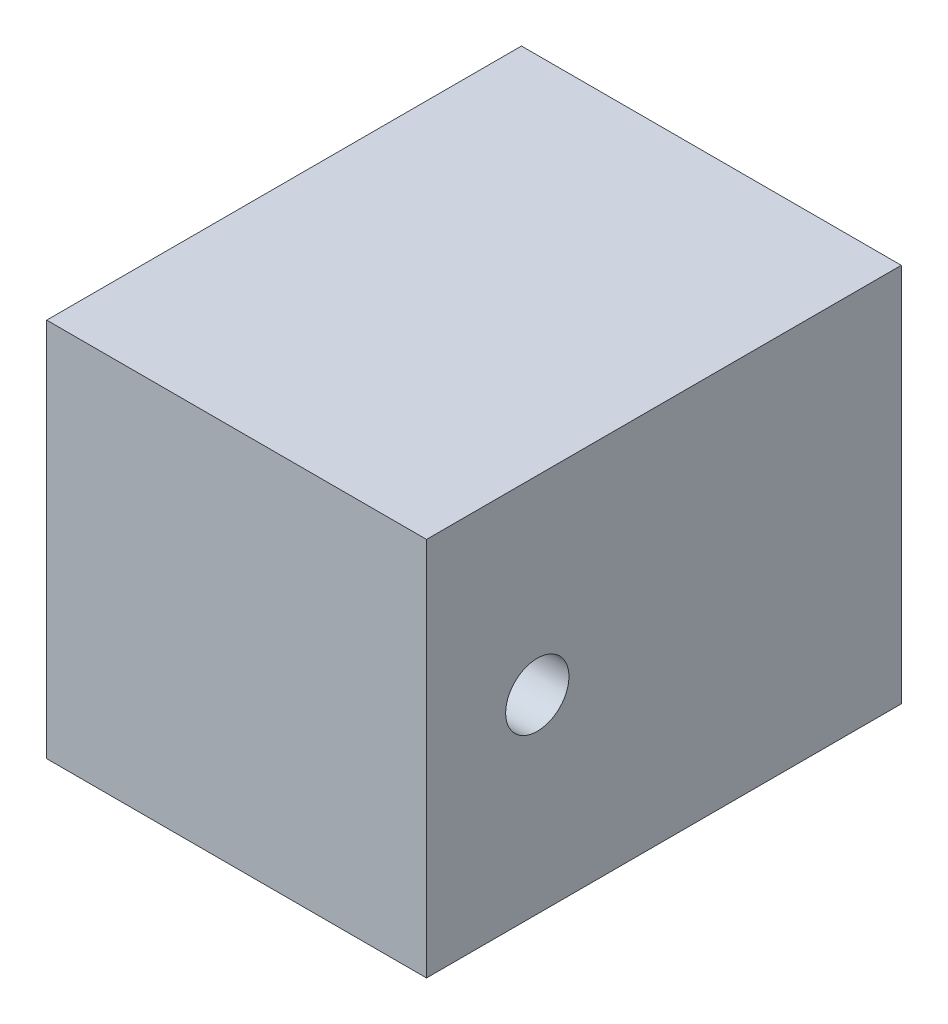
ISO-10303-21;
HEADER;
FILE_DESCRIPTION(('STEP AP214'),'2;1');
FILE_NAME('part.step','',(''),(''),'','','');
FILE_SCHEMA(('AUTOMOTIVE_DESIGN { 1 0 10303 214 1 1 1 1 }'));
ENDSEC;
DATA;
#1=APPLICATION_CONTEXT('core data for automotive mechanical design processes');
#2=APPLICATION_PROTOCOL_DEFINITION('international standard','automotive_design',2000,#1);
#3=PRODUCT_CONTEXT('',#1,'mechanical');
#4=PRODUCT('Part','Part','',(#3));
#5=PRODUCT_RELATED_PRODUCT_CATEGORY('part','',(#4));
#6=PRODUCT_DEFINITION_FORMATION('','',#4);
#7=PRODUCT_DEFINITION_CONTEXT('part definition',#1,'design');
#8=PRODUCT_DEFINITION('design','',#6,#7);
#9=PRODUCT_DEFINITION_SHAPE('','',#8);
#10=(LENGTH_UNIT() NAMED_UNIT(*) SI_UNIT(.MILLI.,.METRE.));
#11=(NAMED_UNIT(*) PLANE_ANGLE_UNIT() SI_UNIT($,.RADIAN.));
#12=(NAMED_UNIT(*) SI_UNIT($,.STERADIAN.) SOLID_ANGLE_UNIT());
#13=UNCERTAINTY_MEASURE_WITH_UNIT(LENGTH_MEASURE(1.E-05),#10,'distance_accuracy_value','');
#14=(GEOMETRIC_REPRESENTATION_CONTEXT(3) GLOBAL_UNCERTAINTY_ASSIGNED_CONTEXT((#13)) GLOBAL_UNIT_ASSIGNED_CONTEXT((#10,
#11,#12)) REPRESENTATION_CONTEXT('',''));
#15=CARTESIAN_POINT('',(0.,0.,0.));
#16=DIRECTION('',(0.,0.,1.));
#17=DIRECTION('',(1.,0.,0.));
#18=AXIS2_PLACEMENT_3D('',#15,#16,#17);
#19=CARTESIAN_POINT('',(0.,0.,0.));
#20=DIRECTION('',(0.,0.,-1.));
#21=DIRECTION('',(-1.,0.,0.));
#22=AXIS2_PLACEMENT_3D('',#19,#20,#21);
#23=PLANE('',#22);
#24=DIRECTION('',(0.,-1.,0.));
#25=VECTOR('',#24,1.);
#26=CARTESIAN_POINT('',(0.,0.,0.));
#27=LINE('',#26,#25);
#28=CARTESIAN_POINT('',(0.,12.,0.));
#29=VERTEX_POINT('',#28);
#30=CARTESIAN_POINT('',(0.,0.,0.));
#31=VERTEX_POINT('',#30);
#32=EDGE_CURVE('E112',#29,#31,#27,.T.);
#33=ORIENTED_EDGE('',*,*,#32,.F.);
#34=DIRECTION('',(-1.,0.,0.));
#35=VECTOR('',#34,1.);
#36=CARTESIAN_POINT('',(0.,12.,0.));
#37=LINE('',#36,#35);
#38=CARTESIAN_POINT('',(12.,12.,0.));
#39=VERTEX_POINT('',#38);
#40=EDGE_CURVE('E63',#39,#29,#37,.T.);
#41=ORIENTED_EDGE('',*,*,#40,.F.);
#42=DIRECTION('',(0.,1.,0.));
#43=VECTOR('',#42,1.);
#44=CARTESIAN_POINT('',(12.,0.,0.));
#45=LINE('',#44,#43);
#46=CARTESIAN_POINT('',(12.,0.,0.));
#47=VERTEX_POINT('',#46);
#48=EDGE_CURVE('E188',#47,#39,#45,.T.);
#49=ORIENTED_EDGE('',*,*,#48,.F.);
#50=DIRECTION('',(1.,0.,0.));
#51=VECTOR('',#50,1.);
#52=CARTESIAN_POINT('',(0.,0.,0.));
#53=LINE('',#52,#51);
#54=EDGE_CURVE('E185',#31,#47,#53,.T.);
#55=ORIENTED_EDGE('',*,*,#54,.F.);
#56=EDGE_LOOP('',(#33,#41,#49,#55));
#57=FACE_BOUND('',#56,.T.);
#58=DIRECTION('',(-1.,0.,0.));
#59=VECTOR('',#58,1.);
#60=CARTESIAN_POINT('',(1.,11.,0.));
#61=LINE('',#60,#59);
#62=CARTESIAN_POINT('',(11.,11.,0.));
#63=VERTEX_POINT('',#62);
#64=CARTESIAN_POINT('',(1.,11.,0.));
#65=VERTEX_POINT('',#64);
#66=EDGE_CURVE('E146',#63,#65,#61,.T.);
#67=ORIENTED_EDGE('',*,*,#66,.T.);
#68=DIRECTION('',(0.,-1.,0.));
#69=VECTOR('',#68,1.);
#70=CARTESIAN_POINT('',(1.,1.,0.));
#71=LINE('',#70,#69);
#72=CARTESIAN_POINT('',(1.,1.,0.));
#73=VERTEX_POINT('',#72);
#74=EDGE_CURVE('E55',#65,#73,#71,.T.);
#75=ORIENTED_EDGE('',*,*,#74,.T.);
#76=DIRECTION('',(1.,0.,0.));
#77=VECTOR('',#76,1.);
#78=CARTESIAN_POINT('',(1.,1.,0.));
#79=LINE('',#78,#77);
#80=CARTESIAN_POINT('',(11.,1.,0.));
#81=VERTEX_POINT('',#80);
#82=EDGE_CURVE('E161',#73,#81,#79,.T.);
#83=ORIENTED_EDGE('',*,*,#82,.T.);
#84=DIRECTION('',(0.,1.,0.));
#85=VECTOR('',#84,1.);
#86=CARTESIAN_POINT('',(11.,1.,0.));
#87=LINE('',#86,#85);
#88=EDGE_CURVE('E165',#81,#63,#87,.T.);
#89=ORIENTED_EDGE('',*,*,#88,.T.);
#90=EDGE_LOOP('',(#67,#75,#83,#89));
#91=FACE_BOUND('',#90,.T.);
#92=ADVANCED_FACE('F39',(#57,#91),#23,.T.);
#93=CARTESIAN_POINT('',(0.,0.,10.));
#94=DIRECTION('',(1.,0.,0.));
#95=DIRECTION('',(0.,0.,-1.));
#96=AXIS2_PLACEMENT_3D('',#93,#94,#95);
#97=PLANE('',#96);
#98=CARTESIAN_POINT('',(0.,6.,11.5));
#99=DIRECTION('',(-1.,0.,0.));
#100=DIRECTION('',(0.,0.,1.));
#101=AXIS2_PLACEMENT_3D('',#98,#99,#100);
#102=CIRCLE('',#101,1.);
#103=CARTESIAN_POINT('',(0.,6.,12.5));
#104=VERTEX_POINT('',#103);
#105=EDGE_CURVE('E133',#104,#104,#102,.T.);
#106=ORIENTED_EDGE('',*,*,#105,.F.);
#107=EDGE_LOOP('',(#106));
#108=FACE_BOUND('',#107,.T.);
#109=ORIENTED_EDGE('',*,*,#32,.T.);
#110=DIRECTION('',(0.,0.,-1.));
#111=VECTOR('',#110,1.);
#112=CARTESIAN_POINT('',(0.,0.,10.));
#113=LINE('',#112,#111);
#114=CARTESIAN_POINT('',(0.,0.,15.));
#115=VERTEX_POINT('',#114);
#116=EDGE_CURVE('E11',#115,#31,#113,.T.);
#117=ORIENTED_EDGE('',*,*,#116,.F.);
#118=DIRECTION('',(0.,-1.,0.));
#119=VECTOR('',#118,1.);
#120=CARTESIAN_POINT('',(0.,12.,15.));
#121=LINE('',#120,#119);
#122=CARTESIAN_POINT('',(0.,12.,15.));
#123=VERTEX_POINT('',#122);
#124=EDGE_CURVE('E110',#123,#115,#121,.T.);
#125=ORIENTED_EDGE('',*,*,#124,.F.);
#126=DIRECTION('',(0.,0.,-1.));
#127=VECTOR('',#126,1.);
#128=CARTESIAN_POINT('',(0.,12.,10.));
#129=LINE('',#128,#127);
#130=EDGE_CURVE('E193',#123,#29,#129,.T.);
#131=ORIENTED_EDGE('',*,*,#130,.T.);
#132=EDGE_LOOP('',(#109,#117,#125,#131));
#133=FACE_BOUND('',#132,.T.);
#134=ADVANCED_FACE('F41',(#108,#133),#97,.F.);
#135=CARTESIAN_POINT('',(0.,0.,10.));
#136=DIRECTION('',(0.,1.,0.));
#137=DIRECTION('',(0.,0.,1.));
#138=AXIS2_PLACEMENT_3D('',#135,#136,#137);
#139=PLANE('',#138);
#140=ORIENTED_EDGE('',*,*,#54,.T.);
#141=DIRECTION('',(0.,0.,-1.));
#142=VECTOR('',#141,1.);
#143=CARTESIAN_POINT('',(12.,0.,10.));
#144=LINE('',#143,#142);
#145=CARTESIAN_POINT('',(12.,0.,15.));
#146=VERTEX_POINT('',#145);
#147=EDGE_CURVE('E48',#146,#47,#144,.T.);
#148=ORIENTED_EDGE('',*,*,#147,.F.);
#149=DIRECTION('',(1.,0.,0.));
#150=VECTOR('',#149,1.);
#151=CARTESIAN_POINT('',(0.,0.,15.));
#152=LINE('',#151,#150);
#153=EDGE_CURVE('E115',#115,#146,#152,.T.);
#154=ORIENTED_EDGE('',*,*,#153,.F.);
#155=ORIENTED_EDGE('',*,*,#116,.T.);
#156=EDGE_LOOP('',(#140,#148,#154,#155));
#157=FACE_BOUND('',#156,.T.);
#158=ADVANCED_FACE('F116',(#157),#139,.F.);
#159=CARTESIAN_POINT('',(12.,0.,10.));
#160=DIRECTION('',(-1.,0.,0.));
#161=DIRECTION('',(0.,0.,1.));
#162=AXIS2_PLACEMENT_3D('',#159,#160,#161);
#163=PLANE('',#162);
#164=CARTESIAN_POINT('',(12.,6.,11.5));
#165=DIRECTION('',(-1.,0.,0.));
#166=DIRECTION('',(0.,0.,1.));
#167=AXIS2_PLACEMENT_3D('',#164,#165,#166);
#168=CIRCLE('',#167,1.);
#169=CARTESIAN_POINT('',(12.,6.,12.5));
#170=VERTEX_POINT('',#169);
#171=EDGE_CURVE('E129',#170,#170,#168,.T.);
#172=ORIENTED_EDGE('',*,*,#171,.T.);
#173=EDGE_LOOP('',(#172));
#174=FACE_BOUND('',#173,.T.);
#175=ORIENTED_EDGE('',*,*,#48,.T.);
#176=DIRECTION('',(0.,0.,-1.));
#177=VECTOR('',#176,1.);
#178=CARTESIAN_POINT('',(12.,12.,10.));
#179=LINE('',#178,#177);
#180=CARTESIAN_POINT('',(12.,12.,15.));
#181=VERTEX_POINT('',#180);
#182=EDGE_CURVE('E196',#181,#39,#179,.T.);
#183=ORIENTED_EDGE('',*,*,#182,.F.);
#184=DIRECTION('',(0.,1.,0.));
#185=VECTOR('',#184,1.);
#186=CARTESIAN_POINT('',(12.,12.,15.));
#187=LINE('',#186,#185);
#188=EDGE_CURVE('E122',#146,#181,#187,.T.);
#189=ORIENTED_EDGE('',*,*,#188,.F.);
#190=ORIENTED_EDGE('',*,*,#147,.T.);
#191=EDGE_LOOP('',(#175,#183,#189,#190));
#192=FACE_BOUND('',#191,.T.);
#193=ADVANCED_FACE('F201',(#174,#192),#163,.F.);
#194=CARTESIAN_POINT('',(0.,12.,10.));
#195=DIRECTION('',(0.,-1.,0.));
#196=DIRECTION('',(0.,0.,-1.));
#197=AXIS2_PLACEMENT_3D('',#194,#195,#196);
#198=PLANE('',#197);
#199=ORIENTED_EDGE('',*,*,#40,.T.);
#200=ORIENTED_EDGE('',*,*,#130,.F.);
#201=DIRECTION('',(-1.,0.,0.));
#202=VECTOR('',#201,1.);
#203=CARTESIAN_POINT('',(0.,12.,15.));
#204=LINE('',#203,#202);
#205=EDGE_CURVE('E127',#181,#123,#204,.T.);
#206=ORIENTED_EDGE('',*,*,#205,.F.);
#207=ORIENTED_EDGE('',*,*,#182,.T.);
#208=EDGE_LOOP('',(#199,#200,#206,#207));
#209=FACE_BOUND('',#208,.T.);
#210=ADVANCED_FACE('F236',(#209),#198,.F.);
#211=CARTESIAN_POINT('',(1.,1.,10.));
#212=DIRECTION('',(1.,0.,0.));
#213=DIRECTION('',(0.,0.,-1.));
#214=AXIS2_PLACEMENT_3D('',#211,#212,#213);
#215=PLANE('',#214);
#216=ORIENTED_EDGE('',*,*,#74,.F.);
#217=DIRECTION('',(0.,0.,-1.));
#218=VECTOR('',#217,1.);
#219=CARTESIAN_POINT('',(1.,11.,10.));
#220=LINE('',#219,#218);
#221=CARTESIAN_POINT('',(1.,11.,10.));
#222=VERTEX_POINT('',#221);
#223=EDGE_CURVE('E158',#222,#65,#220,.T.);
#224=ORIENTED_EDGE('',*,*,#223,.F.);
#225=DIRECTION('',(0.,-1.,0.));
#226=VECTOR('',#225,1.);
#227=CARTESIAN_POINT('',(1.,1.,10.));
#228=LINE('',#227,#226);
#229=CARTESIAN_POINT('',(1.,1.,10.));
#230=VERTEX_POINT('',#229);
#231=EDGE_CURVE('E141',#222,#230,#228,.T.);
#232=ORIENTED_EDGE('',*,*,#231,.T.);
#233=DIRECTION('',(0.,0.,-1.));
#234=VECTOR('',#233,1.);
#235=CARTESIAN_POINT('',(1.,1.,10.));
#236=LINE('',#235,#234);
#237=EDGE_CURVE('E180',#230,#73,#236,.T.);
#238=ORIENTED_EDGE('',*,*,#237,.T.);
#239=EDGE_LOOP('',(#216,#224,#232,#238));
#240=FACE_BOUND('',#239,.T.);
#241=ADVANCED_FACE('F211',(#240),#215,.T.);
#242=CARTESIAN_POINT('',(1.,1.,10.));
#243=DIRECTION('',(0.,1.,0.));
#244=DIRECTION('',(0.,0.,1.));
#245=AXIS2_PLACEMENT_3D('',#242,#243,#244);
#246=PLANE('',#245);
#247=ORIENTED_EDGE('',*,*,#82,.F.);
#248=ORIENTED_EDGE('',*,*,#237,.F.);
#249=DIRECTION('',(1.,0.,0.));
#250=VECTOR('',#249,1.);
#251=CARTESIAN_POINT('',(1.,1.,10.));
#252=LINE('',#251,#250);
#253=CARTESIAN_POINT('',(11.,1.,10.));
#254=VERTEX_POINT('',#253);
#255=EDGE_CURVE('E145',#230,#254,#252,.T.);
#256=ORIENTED_EDGE('',*,*,#255,.T.);
#257=DIRECTION('',(0.,0.,-1.));
#258=VECTOR('',#257,1.);
#259=CARTESIAN_POINT('',(11.,1.,10.));
#260=LINE('',#259,#258);
#261=EDGE_CURVE('E177',#254,#81,#260,.T.);
#262=ORIENTED_EDGE('',*,*,#261,.T.);
#263=EDGE_LOOP('',(#247,#248,#256,#262));
#264=FACE_BOUND('',#263,.T.);
#265=ADVANCED_FACE('F215',(#264),#246,.T.);
#266=CARTESIAN_POINT('',(11.,1.,10.));
#267=DIRECTION('',(-1.,0.,0.));
#268=DIRECTION('',(0.,0.,1.));
#269=AXIS2_PLACEMENT_3D('',#266,#267,#268);
#270=PLANE('',#269);
#271=ORIENTED_EDGE('',*,*,#88,.F.);
#272=ORIENTED_EDGE('',*,*,#261,.F.);
#273=DIRECTION('',(0.,1.,0.));
#274=VECTOR('',#273,1.);
#275=CARTESIAN_POINT('',(11.,1.,10.));
#276=LINE('',#275,#274);
#277=CARTESIAN_POINT('',(11.,11.,10.));
#278=VERTEX_POINT('',#277);
#279=EDGE_CURVE('E150',#254,#278,#276,.T.);
#280=ORIENTED_EDGE('',*,*,#279,.T.);
#281=DIRECTION('',(0.,0.,-1.));
#282=VECTOR('',#281,1.);
#283=CARTESIAN_POINT('',(11.,11.,10.));
#284=LINE('',#283,#282);
#285=EDGE_CURVE('E174',#278,#63,#284,.T.);
#286=ORIENTED_EDGE('',*,*,#285,.T.);
#287=EDGE_LOOP('',(#271,#272,#280,#286));
#288=FACE_BOUND('',#287,.T.);
#289=ADVANCED_FACE('F218',(#288),#270,.T.);
#290=CARTESIAN_POINT('',(1.,11.,10.));
#291=DIRECTION('',(0.,-1.,0.));
#292=DIRECTION('',(0.,0.,-1.));
#293=AXIS2_PLACEMENT_3D('',#290,#291,#292);
#294=PLANE('',#293);
#295=ORIENTED_EDGE('',*,*,#66,.F.);
#296=ORIENTED_EDGE('',*,*,#285,.F.);
#297=DIRECTION('',(-1.,0.,0.));
#298=VECTOR('',#297,1.);
#299=CARTESIAN_POINT('',(1.,11.,10.));
#300=LINE('',#299,#298);
#301=EDGE_CURVE('E154',#278,#222,#300,.T.);
#302=ORIENTED_EDGE('',*,*,#301,.T.);
#303=ORIENTED_EDGE('',*,*,#223,.T.);
#304=EDGE_LOOP('',(#295,#296,#302,#303));
#305=FACE_BOUND('',#304,.T.);
#306=ADVANCED_FACE('F210',(#305),#294,.T.);
#307=CARTESIAN_POINT('',(0.,0.,10.));
#308=DIRECTION('',(0.,0.,1.));
#309=DIRECTION('',(1.,0.,0.));
#310=AXIS2_PLACEMENT_3D('',#307,#308,#309);
#311=PLANE('',#310);
#312=ORIENTED_EDGE('',*,*,#231,.F.);
#313=ORIENTED_EDGE('',*,*,#301,.F.);
#314=ORIENTED_EDGE('',*,*,#279,.F.);
#315=ORIENTED_EDGE('',*,*,#255,.F.);
#316=EDGE_LOOP('',(#312,#313,#314,#315));
#317=FACE_BOUND('',#316,.T.);
#318=ADVANCED_FACE('F219',(#317),#311,.F.);
#319=CARTESIAN_POINT('',(0.,0.,15.));
#320=DIRECTION('',(0.,0.,1.));
#321=DIRECTION('',(1.,0.,0.));
#322=AXIS2_PLACEMENT_3D('',#319,#320,#321);
#323=PLANE('',#322);
#324=ORIENTED_EDGE('',*,*,#124,.T.);
#325=ORIENTED_EDGE('',*,*,#153,.T.);
#326=ORIENTED_EDGE('',*,*,#188,.T.);
#327=ORIENTED_EDGE('',*,*,#205,.T.);
#328=EDGE_LOOP('',(#324,#325,#326,#327));
#329=FACE_BOUND('',#328,.T.);
#330=ADVANCED_FACE('F125',(#329),#323,.T.);
#331=CARTESIAN_POINT('',(12.,6.,11.5));
#332=DIRECTION('',(-1.,0.,0.));
#333=DIRECTION('',(0.,0.,1.));
#334=AXIS2_PLACEMENT_3D('',#331,#332,#333);
#335=CYLINDRICAL_SURFACE('',#334,1.);
#336=ORIENTED_EDGE('',*,*,#171,.F.);
#337=EDGE_LOOP('',(#336));
#338=FACE_BOUND('',#337,.T.);
#339=ORIENTED_EDGE('',*,*,#105,.T.);
#340=EDGE_LOOP('',(#339));
#341=FACE_BOUND('',#340,.T.);
#342=ADVANCED_FACE('F226',(#338,#341),#335,.F.);
#343=CLOSED_SHELL('',(#92,#134,#158,#193,#210,#241,#265,#289,#306,#318,#330,#342));
#344=MANIFOLD_SOLID_BREP('B2',#343);
#345=ADVANCED_BREP_SHAPE_REPRESENTATION('',(#18,#344),#14);
#346=SHAPE_DEFINITION_REPRESENTATION(#9,#345);
ENDSEC;
END-ISO-10303-21;
